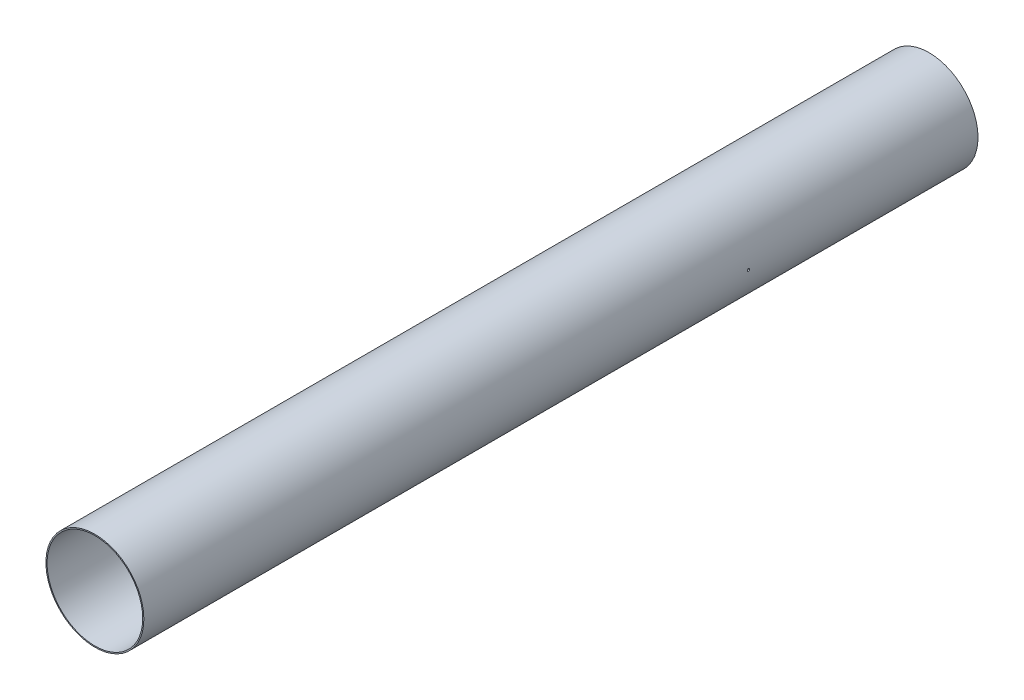
ISO-10303-21;
HEADER;
FILE_DESCRIPTION(('STEP AP214'),'2;1');
FILE_NAME('part.step','',(''),(''),'','','');
FILE_SCHEMA(('AUTOMOTIVE_DESIGN { 1 0 10303 214 1 1 1 1 }'));
ENDSEC;
DATA;
#1=APPLICATION_CONTEXT('core data for automotive mechanical design processes');
#2=APPLICATION_PROTOCOL_DEFINITION('international standard','automotive_design',2000,#1);
#3=PRODUCT_CONTEXT('',#1,'mechanical');
#4=PRODUCT('Part','Part','',(#3));
#5=PRODUCT_RELATED_PRODUCT_CATEGORY('part','',(#4));
#6=PRODUCT_DEFINITION_FORMATION('','',#4);
#7=PRODUCT_DEFINITION_CONTEXT('part definition',#1,'design');
#8=PRODUCT_DEFINITION('design','',#6,#7);
#9=PRODUCT_DEFINITION_SHAPE('','',#8);
#10=(LENGTH_UNIT() NAMED_UNIT(*) SI_UNIT(.MILLI.,.METRE.));
#11=(NAMED_UNIT(*) PLANE_ANGLE_UNIT() SI_UNIT($,.RADIAN.));
#12=(NAMED_UNIT(*) SI_UNIT($,.STERADIAN.) SOLID_ANGLE_UNIT());
#13=UNCERTAINTY_MEASURE_WITH_UNIT(LENGTH_MEASURE(1.E-05),#10,'distance_accuracy_value','');
#14=(GEOMETRIC_REPRESENTATION_CONTEXT(3) GLOBAL_UNCERTAINTY_ASSIGNED_CONTEXT((#13)) GLOBAL_UNIT_ASSIGNED_CONTEXT((#10,
#11,#12)) REPRESENTATION_CONTEXT('',''));
#15=CARTESIAN_POINT('',(0.,0.,0.));
#16=DIRECTION('',(0.,0.,1.));
#17=DIRECTION('',(1.,0.,0.));
#18=AXIS2_PLACEMENT_3D('',#15,#16,#17);
#19=CARTESIAN_POINT('',(0.,0.,545.));
#20=DIRECTION('',(0.,0.,-1.));
#21=DIRECTION('',(-1.,0.,0.));
#22=AXIS2_PLACEMENT_3D('',#19,#20,#21);
#23=CYLINDRICAL_SURFACE('',#22,64.);
#24=CARTESIAN_POINT('',(0.,0.,545.));
#25=DIRECTION('',(0.,0.,1.));
#26=DIRECTION('',(1.,0.,0.));
#27=AXIS2_PLACEMENT_3D('',#24,#25,#26);
#28=CIRCLE('',#27,64.);
#29=CARTESIAN_POINT('',(64.,0.,545.));
#30=VERTEX_POINT('',#29);
#31=EDGE_CURVE('E10',#30,#30,#28,.T.);
#32=ORIENTED_EDGE('',*,*,#31,.F.);
#33=EDGE_LOOP('',(#32));
#34=FACE_BOUND('',#33,.T.);
#35=CARTESIAN_POINT('',(0.,0.,-545.));
#36=DIRECTION('',(0.,0.,1.));
#37=DIRECTION('',(1.,0.,0.));
#38=AXIS2_PLACEMENT_3D('',#35,#36,#37);
#39=CIRCLE('',#38,64.);
#40=CARTESIAN_POINT('',(64.,0.,-545.));
#41=VERTEX_POINT('',#40);
#42=EDGE_CURVE('E57',#41,#41,#39,.T.);
#43=ORIENTED_EDGE('',*,*,#42,.T.);
#44=EDGE_LOOP('',(#43));
#45=FACE_BOUND('',#44,.T.);
#46=CARTESIAN_POINT('',(64.,0.,-243.5));
#47=CARTESIAN_POINT('',(63.9999997628226,-0.0842432464168684,-243.500003732032));
#48=CARTESIAN_POINT('',(63.9998318808151,-0.168547282625932,-243.507120742955));
#49=CARTESIAN_POINT('',(63.9991783052621,-0.334832726654789,-243.535412673163));
#50=CARTESIAN_POINT('',(63.9986922309657,-0.416811228955485,-243.556604434824));
#51=CARTESIAN_POINT('',(63.9974573242793,-0.576012537903433,-243.612441490534));
#52=CARTESIAN_POINT('',(63.9967086192637,-0.653237628624923,-243.647080263724));
#53=CARTESIAN_POINT('',(63.9950329320025,-0.800755036477881,-243.72881887509));
#54=CARTESIAN_POINT('',(63.9941059936076,-0.871049052436259,-243.775915649299));
#55=CARTESIAN_POINT('',(63.9921778862607,-1.00275419936757,-243.881252437427));
#56=CARTESIAN_POINT('',(63.9911766968816,-1.06416287208622,-243.939495524818));
#57=CARTESIAN_POINT('',(63.989213110401,-1.17633367680137,-244.065466827807));
#58=CARTESIAN_POINT('',(63.9882507148373,-1.22709538710168,-244.133195418923));
#59=CARTESIAN_POINT('',(63.9864731723341,-1.31653312424946,-244.276221670224));
#60=CARTESIAN_POINT('',(63.9856580396131,-1.35520798435567,-244.351520060192));
#61=CARTESIAN_POINT('',(63.984267086021,-1.41936646008476,-244.507543196487));
#62=CARTESIAN_POINT('',(63.9836912643767,-1.44485011832753,-244.588267925281));
#63=CARTESIAN_POINT('',(63.9828439833754,-1.48189836496799,-244.752836547514));
#64=CARTESIAN_POINT('',(63.9825724679416,-1.4934655178975,-244.836679863325));
#65=CARTESIAN_POINT('',(63.9823642441199,-1.50236029302677,-245.005118649324));
#66=CARTESIAN_POINT('',(63.9824275346813,-1.49968795991505,-245.08971411715));
#67=CARTESIAN_POINT('',(63.982881733414,-1.48018182272881,-245.257238442651));
#68=CARTESIAN_POINT('',(63.9832725772563,-1.46335079931501,-245.340167624298));
#69=CARTESIAN_POINT('',(63.9843377198551,-1.41600934776061,-245.502023056862));
#70=CARTESIAN_POINT('',(63.9850120191092,-1.38549889560541,-245.580949300751));
#71=CARTESIAN_POINT('',(63.9865681301519,-1.3116614815131,-245.732567315121));
#72=CARTESIAN_POINT('',(63.9874499625887,-1.26833324418766,-245.805258464272));
#73=CARTESIAN_POINT('',(63.9893217048985,-1.17009116000282,-245.942336003861));
#74=CARTESIAN_POINT('',(63.9903116149053,-1.11517729880975,-246.006722384025));
#75=CARTESIAN_POINT('',(63.9922882020089,-0.995307029405604,-246.125378903617));
#76=CARTESIAN_POINT('',(63.9932748782703,-0.930348207208091,-246.179646604409));
#77=CARTESIAN_POINT('',(63.9951335349813,-0.792240497696143,-246.276506516578));
#78=CARTESIAN_POINT('',(63.9960055154139,-0.71909160916529,-246.31909872622));
#79=CARTESIAN_POINT('',(63.9975364866561,-0.56667888522944,-246.391398319663));
#80=CARTESIAN_POINT('',(63.9981954762322,-0.487415014414948,-246.421105628847));
#81=CARTESIAN_POINT('',(63.9992261560904,-0.32502296983581,-246.466790581502));
#82=CARTESIAN_POINT('',(63.999597846855,-0.241894802558639,-246.482768248023));
#83=CARTESIAN_POINT('',(64.0000119668816,-0.0741550866036341,-246.500537379626));
#84=CARTESIAN_POINT('',(64.0000544744495,0.0104561044937873,-246.502332218508));
#85=CARTESIAN_POINT('',(63.9998056434817,0.178778644150422,-246.491693534538));
#86=CARTESIAN_POINT('',(63.9995143051762,0.262489993329928,-246.479260021495));
#87=CARTESIAN_POINT('',(63.9986306717734,0.426627165825056,-246.44052037111));
#88=CARTESIAN_POINT('',(63.9980384098629,0.507053350382806,-246.414215763505));
#89=CARTESIAN_POINT('',(63.9966196814805,0.662348240924929,-246.348482178408));
#90=CARTESIAN_POINT('',(63.9957932147328,0.737216940366718,-246.309053185465));
#91=CARTESIAN_POINT('',(63.993999013421,0.879287126186223,-246.218181390722));
#92=CARTESIAN_POINT('',(63.9930312521545,0.946487159025371,-246.166736316975));
#93=CARTESIAN_POINT('',(63.9910636334422,1.07129784425552,-246.05329604327));
#94=CARTESIAN_POINT('',(63.9900637759412,1.12890848019405,-245.991300825211));
#95=CARTESIAN_POINT('',(63.9881444628188,1.23291623810234,-245.858505651236));
#96=CARTESIAN_POINT('',(63.9872250228287,1.27931118307001,-245.787703989993));
#97=CARTESIAN_POINT('',(63.9855704525309,1.3595556627725,-245.639314499695));
#98=CARTESIAN_POINT('',(63.9848353218936,1.39340521993236,-245.561726682771));
#99=CARTESIAN_POINT('',(63.9836323643983,1.44759425584244,-245.401975542363));
#100=CARTESIAN_POINT('',(63.98316450956,1.467935148804,-245.319812698811));
#101=CARTESIAN_POINT('',(63.9825487732836,1.49453409561045,-245.15323695598));
#102=CARTESIAN_POINT('',(63.9824008918987,1.50079214711293,-245.068824056326));
#103=CARTESIAN_POINT('',(63.982441786071,1.49904758236694,-244.900166302592));
#104=CARTESIAN_POINT('',(63.9826304803614,1.49104840855744,-244.815921412862));
#105=CARTESIAN_POINT('',(63.9833230828703,1.46102351842939,-244.649970603771));
#106=CARTESIAN_POINT('',(63.9838269917176,1.43899777413214,-244.568264689475));
#107=CARTESIAN_POINT('',(63.9850932080193,1.38154524329806,-244.409709338825));
#108=CARTESIAN_POINT('',(63.9858555200567,1.34611821906924,-244.332859988638));
#109=CARTESIAN_POINT('',(63.9875525677277,1.26287055247254,-244.18620193366));
#110=CARTESIAN_POINT('',(63.9884872969175,1.21505037325749,-244.116392965893));
#111=CARTESIAN_POINT('',(63.9904239990653,1.10836596757868,-243.985782883305));
#112=CARTESIAN_POINT('',(63.9914259810868,1.04950025062322,-243.924982986158));
#113=CARTESIAN_POINT('',(63.9933844022882,0.9223798490254,-243.814112577013));
#114=CARTESIAN_POINT('',(63.994340830113,0.854122839770083,-243.764044729376));
#115=CARTESIAN_POINT('',(63.9961005811615,0.710136520114993,-243.676054362163));
#116=CARTESIAN_POINT('',(63.9969038150434,0.634402888218844,-243.63813892109));
#117=CARTESIAN_POINT('',(63.9982649333952,0.477701927426409,-243.575605005316));
#118=CARTESIAN_POINT('',(63.9988231108956,0.396740982855393,-243.550970641456));
#119=CARTESIAN_POINT('',(63.9994817040198,0.262722364036452,-243.522241025082));
#120=CARTESIAN_POINT('',(63.9996752240504,0.210534949297661,-243.513911101767));
#121=CARTESIAN_POINT('',(63.9999344463531,0.105572982386132,-243.502789420217));
#122=CARTESIAN_POINT('',(64.0000001486481,0.0527984303179932,-243.499997660995));
#123=CARTESIAN_POINT('',(64.,0.,-243.5));
#124=B_SPLINE_CURVE_WITH_KNOTS('',3,(#46,#47,#48,#49,#50,#51,#52,#53,#54,#55,#56,#57,#58,#59,
#60,#61,#62,#63,#64,#65,#66,#67,#68,#69,#70,#71,#72,#73,#74,#75,#76,#77,#78,#79,#80,#81,#82,#83,
#84,#85,#86,#87,#88,#89,#90,#91,#92,#93,#94,#95,#96,#97,#98,#99,#100,#101,#102,#103,#104,#105,
#106,#107,#108,#109,#110,#111,#112,#113,#114,#115,#116,#117,#118,#119,#120,#121,#122,#123),
.UNSPECIFIED.,.T.,.F.,(4,2,2,2,2,2,2,2,2,2,2,2,2,2,2,2,2,2,2,2,2,2,2,2,2,2,2,2,2,2,2,2,2,2,2,2,
2,2,4),(0.,0.252537020858128,0.505376782801449,0.758094088035466,1.01074929672769,
1.2634742729008,1.51620925690886,1.76896862984503,2.0217271861274,2.27443915695768,
2.52715033468949,2.77981189342253,3.03247389571148,3.28516104669906,3.53784851031128,
3.79059679395117,4.0433451151302,4.29609489998673,4.548844260536,4.80153349546068,
5.05422255618653,5.30688375559076,5.5595452524372,5.81225456012127,6.0649643013726,
6.31772305509232,6.57048135700065,6.82321319366993,7.07594507237667,7.32861593667213,
7.58128730496991,7.83396315498731,8.08662956344913,8.33933009142394,8.59209328290504,
8.84500343682499,9.09761033989649,9.25588487513771,9.41415938218261),.UNSPECIFIED.);
#125=CARTESIAN_POINT('',(64.,0.,-243.5));
#126=VERTEX_POINT('',#125);
#127=EDGE_CURVE('E69',#126,#126,#124,.T.);
#128=ORIENTED_EDGE('',*,*,#127,.F.);
#129=EDGE_LOOP('',(#128));
#130=FACE_BOUND('',#129,.T.);
#131=ADVANCED_FACE('F43',(#34,#45,#130),#23,.T.);
#132=CARTESIAN_POINT('',(0.,0.,545.));
#133=DIRECTION('',(0.,0.,-1.));
#134=DIRECTION('',(-1.,0.,0.));
#135=AXIS2_PLACEMENT_3D('',#132,#133,#134);
#136=CYLINDRICAL_SURFACE('',#135,62.5);
#137=CARTESIAN_POINT('',(0.,0.,-545.));
#138=DIRECTION('',(0.,0.,1.));
#139=DIRECTION('',(1.,0.,0.));
#140=AXIS2_PLACEMENT_3D('',#137,#138,#139);
#141=CIRCLE('',#140,62.5);
#142=CARTESIAN_POINT('',(62.5,0.,-545.));
#143=VERTEX_POINT('',#142);
#144=EDGE_CURVE('E65',#143,#143,#141,.T.);
#145=ORIENTED_EDGE('',*,*,#144,.F.);
#146=EDGE_LOOP('',(#145));
#147=FACE_BOUND('',#146,.T.);
#148=CARTESIAN_POINT('',(0.,0.,545.));
#149=DIRECTION('',(0.,0.,1.));
#150=DIRECTION('',(1.,0.,0.));
#151=AXIS2_PLACEMENT_3D('',#148,#149,#150);
#152=CIRCLE('',#151,62.5);
#153=CARTESIAN_POINT('',(62.5,0.,545.));
#154=VERTEX_POINT('',#153);
#155=EDGE_CURVE('E63',#154,#154,#152,.T.);
#156=ORIENTED_EDGE('',*,*,#155,.T.);
#157=EDGE_LOOP('',(#156));
#158=FACE_BOUND('',#157,.T.);
#159=CARTESIAN_POINT('',(62.5,0.,-243.5));
#160=CARTESIAN_POINT('',(62.4999997571578,-0.0842426436236576,-243.500003731823));
#161=CARTESIAN_POINT('',(62.4998278484682,-0.168546062295656,-243.507120641296));
#162=CARTESIAN_POINT('',(62.4991585967848,-0.334830246920781,-243.535412145051));
#163=CARTESIAN_POINT('',(62.498660863996,-0.416808108012121,-243.55660357763));
#164=CARTESIAN_POINT('',(62.4973963374838,-0.576008131308582,-243.612439707809));
#165=CARTESIAN_POINT('',(62.4966296742822,-0.653232579187588,-243.647077880078));
#166=CARTESIAN_POINT('',(62.494913791912,-0.800748828797998,-243.728815021292));
#167=CARTESIAN_POINT('',(62.493964617622,-0.871042328397327,-243.775910928015));
#168=CARTESIAN_POINT('',(62.4919902441921,-1.00274722366933,-243.881246201685));
#169=CARTESIAN_POINT('',(62.4909650235028,-1.06415608702202,-243.939488734725));
#170=CARTESIAN_POINT('',(62.4889542983729,-1.17632741146934,-244.065458961948));
#171=CARTESIAN_POINT('',(62.4879687955074,-1.22708945069738,-244.133187031806));
#172=CARTESIAN_POINT('',(62.4861485609272,-1.31652824496819,-244.276212761241));
#173=CARTESIAN_POINT('',(62.4853138446165,-1.35520376557929,-244.351511192965));
#174=CARTESIAN_POINT('',(62.4838894673628,-1.4193635119111,-244.507534635001));
#175=CARTESIAN_POINT('',(62.4832998056135,-1.4448477810347,-244.588259627457));
#176=CARTESIAN_POINT('',(62.4824321580996,-1.48189695877363,-244.752828217342));
#177=CARTESIAN_POINT('',(62.4821541120945,-1.49346455773845,-244.836671208771));
#178=CARTESIAN_POINT('',(62.4819408647153,-1.50236031000208,-245.005109444031));
#179=CARTESIAN_POINT('',(62.482005662243,-1.49968850891385,-245.089704685451));
#180=CARTESIAN_POINT('',(62.4824707386811,-1.48018360977221,-245.257227810247));
#181=CARTESIAN_POINT('',(62.48287094851,-1.46335342778282,-245.340156033362));
#182=CARTESIAN_POINT('',(62.4839616236419,-1.41601401901454,-245.502009690426));
#183=CARTESIAN_POINT('',(62.4846520894644,-1.38550476775728,-245.580935117212));
#184=CARTESIAN_POINT('',(62.486245517431,-1.31166992540785,-245.732552101846));
#185=CARTESIAN_POINT('',(62.4871485017481,-1.26834299686779,-245.805243008137));
#186=CARTESIAN_POINT('',(62.4890651457928,-1.17010370775832,-245.942320343704));
#187=CARTESIAN_POINT('',(62.4900788056661,-1.1151913319318,-246.006706762042));
#188=CARTESIAN_POINT('',(62.4921028345533,-0.995323403170531,-246.125364426582));
#189=CARTESIAN_POINT('',(62.493113202672,-0.930365319010108,-246.17963311579));
#190=CARTESIAN_POINT('',(62.4950164976566,-0.79225884701452,-246.276495134654));
#191=CARTESIAN_POINT('',(62.495909424505,-0.719110457954927,-246.319088462564));
#192=CARTESIAN_POINT('',(62.4974771827409,-0.566698412554793,-246.391390378622));
#193=CARTESIAN_POINT('',(62.4981520128012,-0.487434719002328,-246.421098888359));
#194=CARTESIAN_POINT('',(62.499207480879,-0.32504273206427,-246.466786218689));
#195=CARTESIAN_POINT('',(62.4995881194138,-0.241914445473439,-246.482765063422));
#196=CARTESIAN_POINT('',(62.5000122292339,-0.074175224847208,-246.500536349569));
#197=CARTESIAN_POINT('',(62.5000557845974,0.0104353341901169,-246.502332328592));
#198=CARTESIAN_POINT('',(62.4998010406687,0.178756798388416,-246.49169611766));
#199=CARTESIAN_POINT('',(62.4995027416243,0.262467704201672,-246.479263938021));
#200=CARTESIAN_POINT('',(62.4985979661473,0.426603735465574,-246.440527244773));
#201=CARTESIAN_POINT('',(62.4979915253524,0.507029239723078,-246.414224335351));
#202=CARTESIAN_POINT('',(62.4965388156371,0.662323075494079,-246.348494463748));
#203=CARTESIAN_POINT('',(62.4956925464193,0.737191400113421,-246.309067485287));
#204=CARTESIAN_POINT('',(62.4938553314222,0.879261907617177,-246.218199557233));
#205=CARTESIAN_POINT('',(62.4928643569705,0.946462566495502,-246.166756225469));
#206=CARTESIAN_POINT('',(62.4908495249712,1.07127484997171,-246.053319385448));
#207=CARTESIAN_POINT('',(62.4898256673651,1.12888645750573,-245.991325858418));
#208=CARTESIAN_POINT('',(62.4878602560818,1.23289702617831,-245.858533264998));
#209=CARTESIAN_POINT('',(62.4869187191848,1.27929370466523,-245.787732410426));
#210=CARTESIAN_POINT('',(62.4852243666037,1.35954174937372,-245.639344127993));
#211=CARTESIAN_POINT('',(62.4844715505754,1.39339313846482,-245.561756712505));
#212=CARTESIAN_POINT('',(62.4832396361496,1.4475856981591,-245.402006354822));
#213=CARTESIAN_POINT('',(62.48276050772,1.4679283511266,-245.319843915735));
#214=CARTESIAN_POINT('',(62.4821299034959,1.4945308509291,-245.153268624952));
#215=CARTESIAN_POINT('',(62.4819784277298,1.50079069654216,-245.06885577306));
#216=CARTESIAN_POINT('',(62.4820202183555,1.49904969609286,-244.900198804639));
#217=CARTESIAN_POINT('',(62.4822133975157,1.49105245847582,-244.815954650815));
#218=CARTESIAN_POINT('',(62.4829225368854,1.46103170461056,-244.650005000471));
#219=CARTESIAN_POINT('',(62.4834384977386,1.43900816039658,-244.568299509013));
#220=CARTESIAN_POINT('',(62.4847350255058,1.38156026885267,-244.409744652447));
#221=CARTESIAN_POINT('',(62.4855155970956,1.34613568471877,-244.332895373179));
#222=CARTESIAN_POINT('',(62.4872533124344,1.26289308052027,-244.186237008776));
#223=CARTESIAN_POINT('',(62.4882104496008,1.21507552246237,-244.11642766133));
#224=CARTESIAN_POINT('',(62.4901936087732,1.10839580714604,-243.985815510004));
#225=CARTESIAN_POINT('',(62.4912196408626,1.04953203091814,-243.925014028687));
#226=CARTESIAN_POINT('',(62.4932250873948,0.922415221172148,-243.814140104201));
#227=CARTESIAN_POINT('',(62.4942044902158,0.854159863228015,-243.76407032501));
#228=CARTESIAN_POINT('',(62.4960065388372,0.710176069582491,-243.676075558929));
#229=CARTESIAN_POINT('',(62.4968290923635,0.634443274433106,-243.638157712128));
#230=CARTESIAN_POINT('',(62.49822297275,0.477743446323581,-243.575618907239));
#231=CARTESIAN_POINT('',(62.4987945996127,0.396782797311038,-243.550982062588));
#232=CARTESIAN_POINT('',(62.4994691223223,0.262757570205523,-243.522247030212));
#233=CARTESIAN_POINT('',(62.4996673398909,0.210563266538586,-243.513914860338));
#234=CARTESIAN_POINT('',(62.4999328548275,0.105587268261346,-243.502790176145));
#235=CARTESIAN_POINT('',(62.5000001522201,0.0528055737608479,-243.499997660792));
#236=CARTESIAN_POINT('',(62.5,0.,-243.5));
#237=B_SPLINE_CURVE_WITH_KNOTS('',3,(#159,#160,#161,#162,#163,#164,#165,#166,#167,#168,#169,
#170,#171,#172,#173,#174,#175,#176,#177,#178,#179,#180,#181,#182,#183,#184,#185,#186,#187,#188,
#189,#190,#191,#192,#193,#194,#195,#196,#197,#198,#199,#200,#201,#202,#203,#204,#205,#206,#207,
#208,#209,#210,#211,#212,#213,#214,#215,#216,#217,#218,#219,#220,#221,#222,#223,#224,#225,#226,
#227,#228,#229,#230,#231,#232,#233,#234,#235,#236),.UNSPECIFIED.,.T.,.F.,(4,2,2,2,2,2,2,2,2,2,2,
2,2,2,2,2,2,2,2,2,2,2,2,2,2,2,2,2,2,2,2,2,2,2,2,2,2,2,4),(0.,0.252535186195929,
0.505373042702433,0.758088357024884,1.0107416092985,1.26346673212981,1.51620186697533,
1.76896280597318,2.02172291331183,2.27443414959555,2.52714457637208,2.7798029675791,
3.03246181091406,3.28514702699098,3.5378325758362,3.79058189812398,4.04333125819713,
4.29608215638372,4.54883261019829,4.80152001889676,5.0542072443749,5.30686525230104,
5.55952357366575,5.81223202561154,6.06494092725122,6.31770122124258,6.57046105446073,
6.8231931468085,7.07592526108556,7.32859341834336,7.58126207937434,7.83393520541212,
8.08659891321867,8.33929968119844,8.59206310575575,8.84497477491697,9.0975832392754,
9.25587917255902,9.41417507625183),.UNSPECIFIED.);
#238=CARTESIAN_POINT('',(62.5,0.,-243.5));
#239=VERTEX_POINT('',#238);
#240=EDGE_CURVE('E47',#239,#239,#237,.T.);
#241=ORIENTED_EDGE('',*,*,#240,.T.);
#242=EDGE_LOOP('',(#241));
#243=FACE_BOUND('',#242,.T.);
#244=ADVANCED_FACE('F83',(#147,#158,#243),#136,.F.);
#245=CARTESIAN_POINT('',(0.,0.,545.));
#246=DIRECTION('',(0.,0.,1.));
#247=DIRECTION('',(1.,0.,0.));
#248=AXIS2_PLACEMENT_3D('',#245,#246,#247);
#249=PLANE('',#248);
#250=ORIENTED_EDGE('',*,*,#31,.T.);
#251=EDGE_LOOP('',(#250));
#252=FACE_BOUND('',#251,.T.);
#253=ORIENTED_EDGE('',*,*,#155,.F.);
#254=EDGE_LOOP('',(#253));
#255=FACE_BOUND('',#254,.T.);
#256=ADVANCED_FACE('F88',(#252,#255),#249,.T.);
#257=CARTESIAN_POINT('',(0.,0.,-545.));
#258=DIRECTION('',(0.,0.,1.));
#259=DIRECTION('',(1.,0.,0.));
#260=AXIS2_PLACEMENT_3D('',#257,#258,#259);
#261=PLANE('',#260);
#262=ORIENTED_EDGE('',*,*,#42,.F.);
#263=EDGE_LOOP('',(#262));
#264=FACE_BOUND('',#263,.T.);
#265=ORIENTED_EDGE('',*,*,#144,.T.);
#266=EDGE_LOOP('',(#265));
#267=FACE_BOUND('',#266,.T.);
#268=ADVANCED_FACE('F81',(#264,#267),#261,.F.);
#269=CARTESIAN_POINT('',(64.,0.,-245.));
#270=DIRECTION('',(-1.,0.,0.));
#271=DIRECTION('',(0.,0.,1.));
#272=AXIS2_PLACEMENT_3D('',#269,#270,#271);
#273=CYLINDRICAL_SURFACE('',#272,1.5);
#274=ORIENTED_EDGE('',*,*,#240,.F.);
#275=EDGE_LOOP('',(#274));
#276=FACE_BOUND('',#275,.T.);
#277=ORIENTED_EDGE('',*,*,#127,.T.);
#278=EDGE_LOOP('',(#277));
#279=FACE_BOUND('',#278,.T.);
#280=ADVANCED_FACE('F78',(#276,#279),#273,.F.);
#281=CLOSED_SHELL('',(#131,#244,#256,#268,#280));
#282=MANIFOLD_SOLID_BREP('B2',#281);
#283=ADVANCED_BREP_SHAPE_REPRESENTATION('',(#18,#282),#14);
#284=SHAPE_DEFINITION_REPRESENTATION(#9,#283);
ENDSEC;
END-ISO-10303-21;
